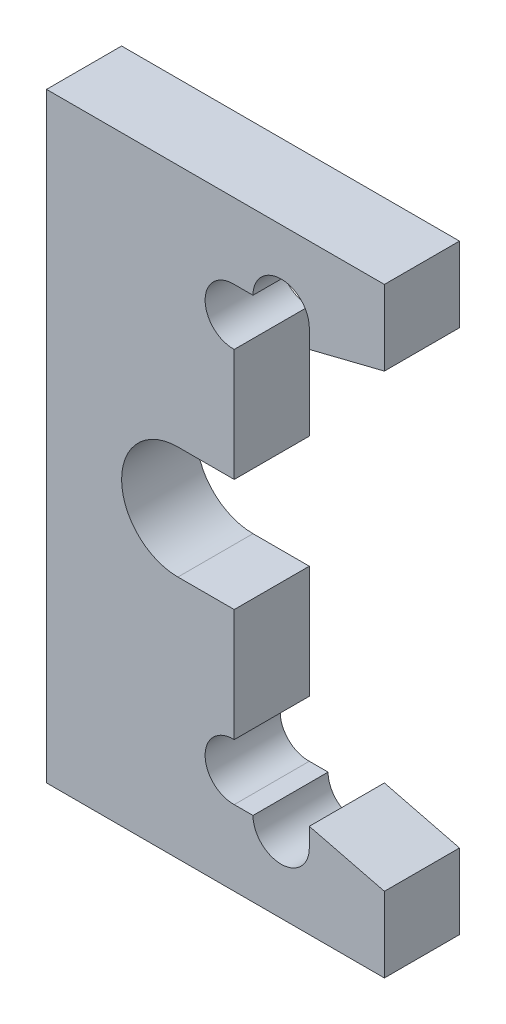
ISO-10303-21;
HEADER;
FILE_DESCRIPTION(('STEP AP214'),'2;1');
FILE_NAME('part.step','',(''),(''),'','','');
FILE_SCHEMA(('AUTOMOTIVE_DESIGN { 1 0 10303 214 1 1 1 1 }'));
ENDSEC;
DATA;
#1=APPLICATION_CONTEXT('core data for automotive mechanical design processes');
#2=APPLICATION_PROTOCOL_DEFINITION('international standard','automotive_design',2000,#1);
#3=PRODUCT_CONTEXT('',#1,'mechanical');
#4=PRODUCT('Part','Part','',(#3));
#5=PRODUCT_RELATED_PRODUCT_CATEGORY('part','',(#4));
#6=PRODUCT_DEFINITION_FORMATION('','',#4);
#7=PRODUCT_DEFINITION_CONTEXT('part definition',#1,'design');
#8=PRODUCT_DEFINITION('design','',#6,#7);
#9=PRODUCT_DEFINITION_SHAPE('','',#8);
#10=(LENGTH_UNIT() NAMED_UNIT(*) SI_UNIT(.MILLI.,.METRE.));
#11=(NAMED_UNIT(*) PLANE_ANGLE_UNIT() SI_UNIT($,.RADIAN.));
#12=(NAMED_UNIT(*) SI_UNIT($,.STERADIAN.) SOLID_ANGLE_UNIT());
#13=UNCERTAINTY_MEASURE_WITH_UNIT(LENGTH_MEASURE(1.E-05),#10,'distance_accuracy_value','');
#14=(GEOMETRIC_REPRESENTATION_CONTEXT(3) GLOBAL_UNCERTAINTY_ASSIGNED_CONTEXT((#13)) GLOBAL_UNIT_ASSIGNED_CONTEXT((#10,
#11,#12)) REPRESENTATION_CONTEXT('',''));
#15=CARTESIAN_POINT('',(0.,0.,0.));
#16=DIRECTION('',(0.,0.,1.));
#17=DIRECTION('',(1.,0.,0.));
#18=AXIS2_PLACEMENT_3D('',#15,#16,#17);
#19=CARTESIAN_POINT('',(9.34232295016829,10.6275109241625,2.));
#20=DIRECTION('',(0.,0.,-1.));
#21=DIRECTION('',(-1.,0.,0.));
#22=AXIS2_PLACEMENT_3D('',#19,#20,#21);
#23=CYLINDRICAL_SURFACE('',#22,0.75);
#24=CARTESIAN_POINT('',(9.34232295016829,10.6275109241625,0.));
#25=DIRECTION('',(0.,0.,-1.));
#26=DIRECTION('',(-1.,0.,0.));
#27=AXIS2_PLACEMENT_3D('',#24,#25,#26);
#28=CIRCLE('',#27,0.75);
#29=CARTESIAN_POINT('',(9.36817322137401,9.87795654756358,0.));
#30=VERTEX_POINT('',#29);
#31=CARTESIAN_POINT('',(9.36817322137401,11.3770653007614,0.));
#32=VERTEX_POINT('',#31);
#33=EDGE_CURVE('E150',#30,#32,#28,.T.);
#34=ORIENTED_EDGE('',*,*,#33,.T.);
#35=DIRECTION('',(0.,0.,-1.));
#36=VECTOR('',#35,1.);
#37=CARTESIAN_POINT('',(9.36817322137401,11.3770653007614,2.));
#38=LINE('',#37,#36);
#39=CARTESIAN_POINT('',(9.36817322137401,11.3770653007614,2.));
#40=VERTEX_POINT('',#39);
#41=EDGE_CURVE('E11',#40,#32,#38,.T.);
#42=ORIENTED_EDGE('',*,*,#41,.F.);
#43=CARTESIAN_POINT('',(9.34232295016829,10.6275109241625,2.));
#44=DIRECTION('',(0.,0.,-1.));
#45=DIRECTION('',(-1.,0.,0.));
#46=AXIS2_PLACEMENT_3D('',#43,#44,#45);
#47=CIRCLE('',#46,0.75);
#48=CARTESIAN_POINT('',(9.36817322137401,9.87795654756358,2.));
#49=VERTEX_POINT('',#48);
#50=EDGE_CURVE('E172',#49,#40,#47,.T.);
#51=ORIENTED_EDGE('',*,*,#50,.F.);
#52=DIRECTION('',(0.,0.,-1.));
#53=VECTOR('',#52,1.);
#54=CARTESIAN_POINT('',(9.36817322137401,9.87795654756358,2.));
#55=LINE('',#54,#53);
#56=EDGE_CURVE('E146',#49,#30,#55,.T.);
#57=ORIENTED_EDGE('',*,*,#56,.T.);
#58=EDGE_LOOP('',(#34,#42,#51,#57));
#59=FACE_BOUND('',#58,.T.);
#60=ADVANCED_FACE('F34',(#59),#23,.F.);
#61=CARTESIAN_POINT('',(9.86817322137401,11.3770653007614,2.));
#62=DIRECTION('',(0.,1.,0.));
#63=DIRECTION('',(-1.,0.,0.));
#64=AXIS2_PLACEMENT_3D('',#61,#62,#63);
#65=PLANE('',#64);
#66=DIRECTION('',(1.,0.,0.));
#67=VECTOR('',#66,1.);
#68=CARTESIAN_POINT('',(9.86817322137401,11.3770653007614,0.));
#69=LINE('',#68,#67);
#70=CARTESIAN_POINT('',(9.86817322137401,11.3770653007614,0.));
#71=VERTEX_POINT('',#70);
#72=EDGE_CURVE('E153',#32,#71,#69,.T.);
#73=ORIENTED_EDGE('',*,*,#72,.T.);
#74=DIRECTION('',(0.,0.,-1.));
#75=VECTOR('',#74,1.);
#76=CARTESIAN_POINT('',(9.86817322137401,11.3770653007614,2.));
#77=LINE('',#76,#75);
#78=CARTESIAN_POINT('',(9.86817322137401,11.3770653007614,2.));
#79=VERTEX_POINT('',#78);
#80=EDGE_CURVE('E42',#79,#71,#77,.T.);
#81=ORIENTED_EDGE('',*,*,#80,.F.);
#82=DIRECTION('',(1.,0.,0.));
#83=VECTOR('',#82,1.);
#84=CARTESIAN_POINT('',(9.86817322137401,11.3770653007614,2.));
#85=LINE('',#84,#83);
#86=EDGE_CURVE('E100',#40,#79,#85,.T.);
#87=ORIENTED_EDGE('',*,*,#86,.F.);
#88=ORIENTED_EDGE('',*,*,#41,.T.);
#89=EDGE_LOOP('',(#73,#81,#87,#88));
#90=FACE_BOUND('',#89,.T.);
#91=ADVANCED_FACE('F319',(#90),#65,.F.);
#92=CARTESIAN_POINT('',(10.618173221374,11.3770653007614,2.));
#93=DIRECTION('',(0.,0.,-1.));
#94=DIRECTION('',(-1.,0.,0.));
#95=AXIS2_PLACEMENT_3D('',#92,#93,#94);
#96=CYLINDRICAL_SURFACE('',#95,0.750000000000001);
#97=CARTESIAN_POINT('',(10.618173221374,11.3770653007614,0.));
#98=DIRECTION('',(0.,0.,-1.));
#99=DIRECTION('',(1.,0.,0.));
#100=AXIS2_PLACEMENT_3D('',#97,#98,#99);
#101=CIRCLE('',#100,0.750000000000001);
#102=CARTESIAN_POINT('',(11.368173221374,11.3770653007614,0.));
#103=VERTEX_POINT('',#102);
#104=EDGE_CURVE('E156',#71,#103,#101,.T.);
#105=ORIENTED_EDGE('',*,*,#104,.T.);
#106=DIRECTION('',(0.,0.,-1.));
#107=VECTOR('',#106,1.);
#108=CARTESIAN_POINT('',(11.368173221374,11.3770653007614,2.));
#109=LINE('',#108,#107);
#110=CARTESIAN_POINT('',(11.368173221374,11.3770653007614,2.));
#111=VERTEX_POINT('',#110);
#112=EDGE_CURVE('E186',#111,#103,#109,.T.);
#113=ORIENTED_EDGE('',*,*,#112,.F.);
#114=CARTESIAN_POINT('',(10.618173221374,11.3770653007614,2.));
#115=DIRECTION('',(0.,0.,-1.));
#116=DIRECTION('',(1.,0.,0.));
#117=AXIS2_PLACEMENT_3D('',#114,#115,#116);
#118=CIRCLE('',#117,0.750000000000001);
#119=EDGE_CURVE('E194',#79,#111,#118,.T.);
#120=ORIENTED_EDGE('',*,*,#119,.F.);
#121=ORIENTED_EDGE('',*,*,#80,.T.);
#122=EDGE_LOOP('',(#105,#113,#120,#121));
#123=FACE_BOUND('',#122,.T.);
#124=ADVANCED_FACE('F192',(#123),#96,.F.);
#125=CARTESIAN_POINT('',(11.368173221374,11.3770653007614,2.));
#126=DIRECTION('',(1.,0.,0.));
#127=DIRECTION('',(0.,0.,-1.));
#128=AXIS2_PLACEMENT_3D('',#125,#126,#127);
#129=PLANE('',#128);
#130=DIRECTION('',(0.,-1.,0.));
#131=VECTOR('',#130,1.);
#132=CARTESIAN_POINT('',(11.368173221374,11.3770653007614,0.));
#133=LINE('',#132,#131);
#134=CARTESIAN_POINT('',(11.368173221374,10.8770653007614,0.));
#135=VERTEX_POINT('',#134);
#136=EDGE_CURVE('E158',#103,#135,#133,.T.);
#137=ORIENTED_EDGE('',*,*,#136,.T.);
#138=DIRECTION('',(0.,0.,-1.));
#139=VECTOR('',#138,1.);
#140=CARTESIAN_POINT('',(11.368173221374,10.8770653007614,2.));
#141=LINE('',#140,#139);
#142=CARTESIAN_POINT('',(11.368173221374,10.8770653007614,2.));
#143=VERTEX_POINT('',#142);
#144=EDGE_CURVE('E183',#143,#135,#141,.T.);
#145=ORIENTED_EDGE('',*,*,#144,.F.);
#146=DIRECTION('',(0.,-1.,0.));
#147=VECTOR('',#146,1.);
#148=CARTESIAN_POINT('',(11.368173221374,11.3770653007614,2.));
#149=LINE('',#148,#147);
#150=EDGE_CURVE('E212',#111,#143,#149,.T.);
#151=ORIENTED_EDGE('',*,*,#150,.F.);
#152=ORIENTED_EDGE('',*,*,#112,.T.);
#153=EDGE_LOOP('',(#137,#145,#151,#152));
#154=FACE_BOUND('',#153,.T.);
#155=ADVANCED_FACE('F203',(#154),#129,.F.);
#156=CARTESIAN_POINT('',(11.368173221374,10.8770653007614,2.));
#157=DIRECTION('',(-0.242535625036333,0.970142500145332,0.));
#158=DIRECTION('',(-0.970142500145332,-0.242535625036333,0.));
#159=AXIS2_PLACEMENT_3D('',#156,#157,#158);
#160=PLANE('',#159);
#161=DIRECTION('',(0.970142500145332,0.242535625036333,0.));
#162=VECTOR('',#161,1.);
#163=CARTESIAN_POINT('',(11.368173221374,10.8770653007614,0.));
#164=LINE('',#163,#162);
#165=CARTESIAN_POINT('',(13.368173221374,11.3770653007614,0.));
#166=VERTEX_POINT('',#165);
#167=EDGE_CURVE('E160',#135,#166,#164,.T.);
#168=ORIENTED_EDGE('',*,*,#167,.T.);
#169=DIRECTION('',(0.,0.,-1.));
#170=VECTOR('',#169,1.);
#171=CARTESIAN_POINT('',(13.368173221374,11.3770653007614,2.));
#172=LINE('',#171,#170);
#173=CARTESIAN_POINT('',(13.368173221374,11.3770653007614,2.));
#174=VERTEX_POINT('',#173);
#175=EDGE_CURVE('E180',#174,#166,#172,.T.);
#176=ORIENTED_EDGE('',*,*,#175,.F.);
#177=DIRECTION('',(0.970142500145332,0.242535625036333,0.));
#178=VECTOR('',#177,1.);
#179=CARTESIAN_POINT('',(11.368173221374,10.8770653007614,2.));
#180=LINE('',#179,#178);
#181=EDGE_CURVE('E209',#143,#174,#180,.T.);
#182=ORIENTED_EDGE('',*,*,#181,.F.);
#183=ORIENTED_EDGE('',*,*,#144,.T.);
#184=EDGE_LOOP('',(#168,#176,#182,#183));
#185=FACE_BOUND('',#184,.T.);
#186=ADVANCED_FACE('F207',(#185),#160,.F.);
#187=CARTESIAN_POINT('',(13.368173221374,11.3770653007614,2.));
#188=DIRECTION('',(-1.,0.,0.));
#189=DIRECTION('',(0.,0.,1.));
#190=AXIS2_PLACEMENT_3D('',#187,#188,#189);
#191=PLANE('',#190);
#192=DIRECTION('',(0.,1.,0.));
#193=VECTOR('',#192,1.);
#194=CARTESIAN_POINT('',(13.368173221374,11.3770653007614,0.));
#195=LINE('',#194,#193);
#196=CARTESIAN_POINT('',(13.368173221374,13.3770653007614,0.));
#197=VERTEX_POINT('',#196);
#198=EDGE_CURVE('E162',#166,#197,#195,.T.);
#199=ORIENTED_EDGE('',*,*,#198,.T.);
#200=DIRECTION('',(0.,0.,-1.));
#201=VECTOR('',#200,1.);
#202=CARTESIAN_POINT('',(13.368173221374,13.3770653007614,2.));
#203=LINE('',#202,#201);
#204=CARTESIAN_POINT('',(13.368173221374,13.3770653007614,2.));
#205=VERTEX_POINT('',#204);
#206=EDGE_CURVE('E177',#205,#197,#203,.T.);
#207=ORIENTED_EDGE('',*,*,#206,.F.);
#208=DIRECTION('',(0.,1.,0.));
#209=VECTOR('',#208,1.);
#210=CARTESIAN_POINT('',(13.368173221374,11.3770653007614,2.));
#211=LINE('',#210,#209);
#212=EDGE_CURVE('E211',#174,#205,#211,.T.);
#213=ORIENTED_EDGE('',*,*,#212,.F.);
#214=ORIENTED_EDGE('',*,*,#175,.T.);
#215=EDGE_LOOP('',(#199,#207,#213,#214));
#216=FACE_BOUND('',#215,.T.);
#217=ADVANCED_FACE('F331',(#216),#191,.F.);
#218=CARTESIAN_POINT('',(13.368173221374,13.3770653007614,2.));
#219=DIRECTION('',(0.,-1.,0.));
#220=DIRECTION('',(1.,0.,0.));
#221=AXIS2_PLACEMENT_3D('',#218,#219,#220);
#222=PLANE('',#221);
#223=DIRECTION('',(-1.,0.,0.));
#224=VECTOR('',#223,1.);
#225=CARTESIAN_POINT('',(13.368173221374,13.3770653007614,0.));
#226=LINE('',#225,#224);
#227=CARTESIAN_POINT('',(4.36817322137401,13.3770653007614,0.));
#228=VERTEX_POINT('',#227);
#229=EDGE_CURVE('E164',#197,#228,#226,.T.);
#230=ORIENTED_EDGE('',*,*,#229,.T.);
#231=DIRECTION('',(0.,0.,-1.));
#232=VECTOR('',#231,1.);
#233=CARTESIAN_POINT('',(4.36817322137401,13.3770653007614,2.));
#234=LINE('',#233,#232);
#235=CARTESIAN_POINT('',(4.36817322137401,13.3770653007614,2.));
#236=VERTEX_POINT('',#235);
#237=EDGE_CURVE('E141',#236,#228,#234,.T.);
#238=ORIENTED_EDGE('',*,*,#237,.F.);
#239=DIRECTION('',(-1.,0.,0.));
#240=VECTOR('',#239,1.);
#241=CARTESIAN_POINT('',(13.368173221374,13.3770653007614,2.));
#242=LINE('',#241,#240);
#243=EDGE_CURVE('E214',#205,#236,#242,.T.);
#244=ORIENTED_EDGE('',*,*,#243,.F.);
#245=ORIENTED_EDGE('',*,*,#206,.T.);
#246=EDGE_LOOP('',(#230,#238,#244,#245));
#247=FACE_BOUND('',#246,.T.);
#248=ADVANCED_FACE('F334',(#247),#222,.F.);
#249=CARTESIAN_POINT('',(4.36817322137401,13.3770653007614,2.));
#250=DIRECTION('',(1.,0.,0.));
#251=DIRECTION('',(0.,1.,0.));
#252=AXIS2_PLACEMENT_3D('',#249,#250,#251);
#253=PLANE('',#252);
#254=DIRECTION('',(0.,-1.,0.));
#255=VECTOR('',#254,1.);
#256=CARTESIAN_POINT('',(4.36817322137401,13.3770653007614,0.));
#257=LINE('',#256,#255);
#258=CARTESIAN_POINT('',(4.368173221374,-2.62293469923858,0.));
#259=VERTEX_POINT('',#258);
#260=EDGE_CURVE('E166',#228,#259,#257,.T.);
#261=ORIENTED_EDGE('',*,*,#260,.T.);
#262=DIRECTION('',(0.,0.,-1.));
#263=VECTOR('',#262,1.);
#264=CARTESIAN_POINT('',(4.368173221374,-2.62293469923858,2.));
#265=LINE('',#264,#263);
#266=CARTESIAN_POINT('',(4.368173221374,-2.62293469923858,2.));
#267=VERTEX_POINT('',#266);
#268=EDGE_CURVE('E234',#267,#259,#265,.T.);
#269=ORIENTED_EDGE('',*,*,#268,.F.);
#270=DIRECTION('',(0.,-1.,0.));
#271=VECTOR('',#270,1.);
#272=CARTESIAN_POINT('',(4.36817322137401,13.3770653007614,2.));
#273=LINE('',#272,#271);
#274=EDGE_CURVE('E135',#236,#267,#273,.T.);
#275=ORIENTED_EDGE('',*,*,#274,.F.);
#276=ORIENTED_EDGE('',*,*,#237,.T.);
#277=EDGE_LOOP('',(#261,#269,#275,#276));
#278=FACE_BOUND('',#277,.T.);
#279=ADVANCED_FACE('F235',(#278),#253,.F.);
#280=CARTESIAN_POINT('',(7.86817322137401,5.37706530076142,2.));
#281=DIRECTION('',(0.,0.,-1.));
#282=DIRECTION('',(-1.,0.,0.));
#283=AXIS2_PLACEMENT_3D('',#280,#281,#282);
#284=CYLINDRICAL_SURFACE('',#283,1.5);
#285=CARTESIAN_POINT('',(7.86817322137401,5.37706530076142,0.));
#286=DIRECTION('',(0.,0.,-1.));
#287=DIRECTION('',(1.,0.,0.));
#288=AXIS2_PLACEMENT_3D('',#285,#286,#287);
#289=CIRCLE('',#288,1.5);
#290=CARTESIAN_POINT('',(7.86817322137401,3.87706530076142,0.));
#291=VERTEX_POINT('',#290);
#292=CARTESIAN_POINT('',(7.86817322137401,6.87706530076142,0.));
#293=VERTEX_POINT('',#292);
#294=EDGE_CURVE('E140',#291,#293,#289,.T.);
#295=ORIENTED_EDGE('',*,*,#294,.T.);
#296=DIRECTION('',(0.,0.,-1.));
#297=VECTOR('',#296,1.);
#298=CARTESIAN_POINT('',(7.86817322137401,6.87706530076142,2.));
#299=LINE('',#298,#297);
#300=CARTESIAN_POINT('',(7.86817322137401,6.87706530076142,2.));
#301=VERTEX_POINT('',#300);
#302=EDGE_CURVE('E137',#301,#293,#299,.T.);
#303=ORIENTED_EDGE('',*,*,#302,.F.);
#304=CARTESIAN_POINT('',(7.86817322137401,5.37706530076142,2.));
#305=DIRECTION('',(0.,0.,-1.));
#306=DIRECTION('',(1.,0.,0.));
#307=AXIS2_PLACEMENT_3D('',#304,#305,#306);
#308=CIRCLE('',#307,1.5);
#309=CARTESIAN_POINT('',(7.86817322137401,3.87706530076142,2.));
#310=VERTEX_POINT('',#309);
#311=EDGE_CURVE('E123',#310,#301,#308,.T.);
#312=ORIENTED_EDGE('',*,*,#311,.F.);
#313=DIRECTION('',(0.,0.,-1.));
#314=VECTOR('',#313,1.);
#315=CARTESIAN_POINT('',(7.86817322137401,3.87706530076142,2.));
#316=LINE('',#315,#314);
#317=EDGE_CURVE('E241',#310,#291,#316,.T.);
#318=ORIENTED_EDGE('',*,*,#317,.T.);
#319=EDGE_LOOP('',(#295,#303,#312,#318));
#320=FACE_BOUND('',#319,.T.);
#321=ADVANCED_FACE('F138',(#320),#284,.F.);
#322=CARTESIAN_POINT('',(9.36817322137401,6.87706530076142,2.));
#323=DIRECTION('',(0.,1.,0.));
#324=DIRECTION('',(0.,0.,1.));
#325=AXIS2_PLACEMENT_3D('',#322,#323,#324);
#326=PLANE('',#325);
#327=DIRECTION('',(1.,0.,0.));
#328=VECTOR('',#327,1.);
#329=CARTESIAN_POINT('',(9.36817322137401,6.87706530076142,0.));
#330=LINE('',#329,#328);
#331=CARTESIAN_POINT('',(9.36817322137401,6.87706530076142,0.));
#332=VERTEX_POINT('',#331);
#333=EDGE_CURVE('E86',#293,#332,#330,.T.);
#334=ORIENTED_EDGE('',*,*,#333,.T.);
#335=DIRECTION('',(0.,0.,-1.));
#336=VECTOR('',#335,1.);
#337=CARTESIAN_POINT('',(9.36817322137401,6.87706530076142,2.));
#338=LINE('',#337,#336);
#339=CARTESIAN_POINT('',(9.36817322137401,6.87706530076142,2.));
#340=VERTEX_POINT('',#339);
#341=EDGE_CURVE('E142',#340,#332,#338,.T.);
#342=ORIENTED_EDGE('',*,*,#341,.F.);
#343=DIRECTION('',(1.,0.,0.));
#344=VECTOR('',#343,1.);
#345=CARTESIAN_POINT('',(9.36817322137401,6.87706530076142,2.));
#346=LINE('',#345,#344);
#347=EDGE_CURVE('E127',#301,#340,#346,.T.);
#348=ORIENTED_EDGE('',*,*,#347,.F.);
#349=ORIENTED_EDGE('',*,*,#302,.T.);
#350=EDGE_LOOP('',(#334,#342,#348,#349));
#351=FACE_BOUND('',#350,.T.);
#352=ADVANCED_FACE('F144',(#351),#326,.F.);
#353=CARTESIAN_POINT('',(9.36817322137401,9.87795654756358,2.));
#354=DIRECTION('',(-1.,0.,0.));
#355=DIRECTION('',(0.,0.,1.));
#356=AXIS2_PLACEMENT_3D('',#353,#354,#355);
#357=PLANE('',#356);
#358=DIRECTION('',(0.,1.,0.));
#359=VECTOR('',#358,1.);
#360=CARTESIAN_POINT('',(9.36817322137401,9.87795654756358,0.));
#361=LINE('',#360,#359);
#362=EDGE_CURVE('E92',#332,#30,#361,.T.);
#363=ORIENTED_EDGE('',*,*,#362,.T.);
#364=ORIENTED_EDGE('',*,*,#56,.F.);
#365=DIRECTION('',(0.,1.,0.));
#366=VECTOR('',#365,1.);
#367=CARTESIAN_POINT('',(9.36817322137401,9.87795654756358,2.));
#368=LINE('',#367,#366);
#369=EDGE_CURVE('E50',#340,#49,#368,.T.);
#370=ORIENTED_EDGE('',*,*,#369,.F.);
#371=ORIENTED_EDGE('',*,*,#341,.T.);
#372=EDGE_LOOP('',(#363,#364,#370,#371));
#373=FACE_BOUND('',#372,.T.);
#374=ADVANCED_FACE('F345',(#373),#357,.F.);
#375=CARTESIAN_POINT('',(9.34232295016829,10.6275109241625,2.));
#376=DIRECTION('',(0.,0.,-1.));
#377=DIRECTION('',(-1.,0.,0.));
#378=AXIS2_PLACEMENT_3D('',#375,#376,#377);
#379=PLANE('',#378);
#380=ORIENTED_EDGE('',*,*,#50,.T.);
#381=ORIENTED_EDGE('',*,*,#86,.T.);
#382=ORIENTED_EDGE('',*,*,#119,.T.);
#383=ORIENTED_EDGE('',*,*,#150,.T.);
#384=ORIENTED_EDGE('',*,*,#181,.T.);
#385=ORIENTED_EDGE('',*,*,#212,.T.);
#386=ORIENTED_EDGE('',*,*,#243,.T.);
#387=ORIENTED_EDGE('',*,*,#274,.T.);
#388=DIRECTION('',(-1.,0.,0.));
#389=VECTOR('',#388,1.);
#390=CARTESIAN_POINT('',(13.368173221374,-2.62293469923859,2.));
#391=LINE('',#390,#389);
#392=CARTESIAN_POINT('',(13.368173221374,-2.62293469923859,2.));
#393=VERTEX_POINT('',#392);
#394=EDGE_CURVE('E227',#393,#267,#391,.T.);
#395=ORIENTED_EDGE('',*,*,#394,.F.);
#396=DIRECTION('',(0.,-1.,0.));
#397=VECTOR('',#396,1.);
#398=CARTESIAN_POINT('',(13.368173221374,-0.622934699238586,2.));
#399=LINE('',#398,#397);
#400=CARTESIAN_POINT('',(13.368173221374,-0.622934699238586,2.));
#401=VERTEX_POINT('',#400);
#402=EDGE_CURVE('E247',#401,#393,#399,.T.);
#403=ORIENTED_EDGE('',*,*,#402,.F.);
#404=DIRECTION('',(0.970142500145332,-0.242535625036334,0.));
#405=VECTOR('',#404,1.);
#406=CARTESIAN_POINT('',(11.368173221374,-0.122934699238584,2.));
#407=LINE('',#406,#405);
#408=CARTESIAN_POINT('',(11.368173221374,-0.122934699238584,2.));
#409=VERTEX_POINT('',#408);
#410=EDGE_CURVE('E249',#409,#401,#407,.T.);
#411=ORIENTED_EDGE('',*,*,#410,.F.);
#412=DIRECTION('',(0.,1.,0.));
#413=VECTOR('',#412,1.);
#414=CARTESIAN_POINT('',(11.368173221374,-0.622934699238584,2.));
#415=LINE('',#414,#413);
#416=CARTESIAN_POINT('',(11.368173221374,-0.622934699238584,2.));
#417=VERTEX_POINT('',#416);
#418=EDGE_CURVE('E257',#417,#409,#415,.T.);
#419=ORIENTED_EDGE('',*,*,#418,.F.);
#420=CARTESIAN_POINT('',(10.618173221374,-0.622934699238582,2.));
#421=DIRECTION('',(0.,0.,1.));
#422=DIRECTION('',(1.,0.,0.));
#423=AXIS2_PLACEMENT_3D('',#420,#421,#422);
#424=CIRCLE('',#423,0.750000000000001);
#425=CARTESIAN_POINT('',(9.86817322137401,-0.622934699238581,2.));
#426=VERTEX_POINT('',#425);
#427=EDGE_CURVE('E260',#426,#417,#424,.T.);
#428=ORIENTED_EDGE('',*,*,#427,.F.);
#429=DIRECTION('',(1.,0.,0.));
#430=VECTOR('',#429,1.);
#431=CARTESIAN_POINT('',(9.86817322137401,-0.622934699238581,2.));
#432=LINE('',#431,#430);
#433=CARTESIAN_POINT('',(9.36817322137401,-0.622934699238582,2.));
#434=VERTEX_POINT('',#433);
#435=EDGE_CURVE('E263',#434,#426,#432,.T.);
#436=ORIENTED_EDGE('',*,*,#435,.F.);
#437=CARTESIAN_POINT('',(9.34232295016828,0.126619677360334,2.));
#438=DIRECTION('',(0.,0.,1.));
#439=DIRECTION('',(-1.,0.,0.));
#440=AXIS2_PLACEMENT_3D('',#437,#438,#439);
#441=CIRCLE('',#440,0.75);
#442=CARTESIAN_POINT('',(9.36817322137401,0.876174053959251,2.));
#443=VERTEX_POINT('',#442);
#444=EDGE_CURVE('E293',#443,#434,#441,.T.);
#445=ORIENTED_EDGE('',*,*,#444,.F.);
#446=DIRECTION('',(0.,-1.,0.));
#447=VECTOR('',#446,1.);
#448=CARTESIAN_POINT('',(9.36817322137401,0.876174053959251,2.));
#449=LINE('',#448,#447);
#450=CARTESIAN_POINT('',(9.36817322137401,3.87706530076142,2.));
#451=VERTEX_POINT('',#450);
#452=EDGE_CURVE('E251',#451,#443,#449,.T.);
#453=ORIENTED_EDGE('',*,*,#452,.F.);
#454=DIRECTION('',(1.,0.,0.));
#455=VECTOR('',#454,1.);
#456=CARTESIAN_POINT('',(9.36817322137401,3.87706530076142,2.));
#457=LINE('',#456,#455);
#458=EDGE_CURVE('E131',#310,#451,#457,.T.);
#459=ORIENTED_EDGE('',*,*,#458,.F.);
#460=ORIENTED_EDGE('',*,*,#311,.T.);
#461=ORIENTED_EDGE('',*,*,#347,.T.);
#462=ORIENTED_EDGE('',*,*,#369,.T.);
#463=EDGE_LOOP('',(#380,#381,#382,#383,#384,#385,#386,#387,#395,#403,#411,#419,#428,#436,#445,
#453,#459,#460,#461,#462));
#464=FACE_BOUND('',#463,.T.);
#465=ADVANCED_FACE('F125',(#464),#379,.F.);
#466=CARTESIAN_POINT('',(9.34232295016829,10.6275109241625,0.));
#467=DIRECTION('',(0.,0.,-1.));
#468=DIRECTION('',(-1.,0.,0.));
#469=AXIS2_PLACEMENT_3D('',#466,#467,#468);
#470=PLANE('',#469);
#471=ORIENTED_EDGE('',*,*,#33,.F.);
#472=ORIENTED_EDGE('',*,*,#362,.F.);
#473=ORIENTED_EDGE('',*,*,#333,.F.);
#474=ORIENTED_EDGE('',*,*,#294,.F.);
#475=DIRECTION('',(1.,0.,0.));
#476=VECTOR('',#475,1.);
#477=CARTESIAN_POINT('',(9.36817322137401,3.87706530076142,0.));
#478=LINE('',#477,#476);
#479=CARTESIAN_POINT('',(9.36817322137401,3.87706530076142,0.));
#480=VERTEX_POINT('',#479);
#481=EDGE_CURVE('E273',#291,#480,#478,.T.);
#482=ORIENTED_EDGE('',*,*,#481,.T.);
#483=DIRECTION('',(0.,-1.,0.));
#484=VECTOR('',#483,1.);
#485=CARTESIAN_POINT('',(9.36817322137401,0.876174053959251,0.));
#486=LINE('',#485,#484);
#487=CARTESIAN_POINT('',(9.36817322137401,0.876174053959251,0.));
#488=VERTEX_POINT('',#487);
#489=EDGE_CURVE('E270',#480,#488,#486,.T.);
#490=ORIENTED_EDGE('',*,*,#489,.T.);
#491=CARTESIAN_POINT('',(9.34232295016828,0.126619677360334,0.));
#492=DIRECTION('',(0.,0.,1.));
#493=DIRECTION('',(-1.,0.,0.));
#494=AXIS2_PLACEMENT_3D('',#491,#492,#493);
#495=CIRCLE('',#494,0.75);
#496=CARTESIAN_POINT('',(9.36817322137401,-0.622934699238582,0.));
#497=VERTEX_POINT('',#496);
#498=EDGE_CURVE('E267',#488,#497,#495,.T.);
#499=ORIENTED_EDGE('',*,*,#498,.T.);
#500=DIRECTION('',(1.,0.,0.));
#501=VECTOR('',#500,1.);
#502=CARTESIAN_POINT('',(9.86817322137401,-0.622934699238581,0.));
#503=LINE('',#502,#501);
#504=CARTESIAN_POINT('',(9.86817322137401,-0.622934699238581,0.));
#505=VERTEX_POINT('',#504);
#506=EDGE_CURVE('E290',#497,#505,#503,.T.);
#507=ORIENTED_EDGE('',*,*,#506,.T.);
#508=CARTESIAN_POINT('',(10.618173221374,-0.622934699238582,0.));
#509=DIRECTION('',(0.,0.,1.));
#510=DIRECTION('',(1.,0.,0.));
#511=AXIS2_PLACEMENT_3D('',#508,#509,#510);
#512=CIRCLE('',#511,0.750000000000001);
#513=CARTESIAN_POINT('',(11.368173221374,-0.622934699238584,0.));
#514=VERTEX_POINT('',#513);
#515=EDGE_CURVE('E287',#505,#514,#512,.T.);
#516=ORIENTED_EDGE('',*,*,#515,.T.);
#517=DIRECTION('',(0.,1.,0.));
#518=VECTOR('',#517,1.);
#519=CARTESIAN_POINT('',(11.368173221374,-0.622934699238584,0.));
#520=LINE('',#519,#518);
#521=CARTESIAN_POINT('',(11.368173221374,-0.122934699238584,0.));
#522=VERTEX_POINT('',#521);
#523=EDGE_CURVE('E284',#514,#522,#520,.T.);
#524=ORIENTED_EDGE('',*,*,#523,.T.);
#525=DIRECTION('',(0.970142500145332,-0.242535625036334,0.));
#526=VECTOR('',#525,1.);
#527=CARTESIAN_POINT('',(11.368173221374,-0.122934699238584,0.));
#528=LINE('',#527,#526);
#529=CARTESIAN_POINT('',(13.368173221374,-0.622934699238586,0.));
#530=VERTEX_POINT('',#529);
#531=EDGE_CURVE('E281',#522,#530,#528,.T.);
#532=ORIENTED_EDGE('',*,*,#531,.T.);
#533=DIRECTION('',(0.,-1.,0.));
#534=VECTOR('',#533,1.);
#535=CARTESIAN_POINT('',(13.368173221374,-0.622934699238586,0.));
#536=LINE('',#535,#534);
#537=CARTESIAN_POINT('',(13.368173221374,-2.62293469923859,0.));
#538=VERTEX_POINT('',#537);
#539=EDGE_CURVE('E278',#530,#538,#536,.T.);
#540=ORIENTED_EDGE('',*,*,#539,.T.);
#541=DIRECTION('',(-1.,0.,0.));
#542=VECTOR('',#541,1.);
#543=CARTESIAN_POINT('',(13.368173221374,-2.62293469923859,0.));
#544=LINE('',#543,#542);
#545=EDGE_CURVE('E276',#538,#259,#544,.T.);
#546=ORIENTED_EDGE('',*,*,#545,.T.);
#547=ORIENTED_EDGE('',*,*,#260,.F.);
#548=ORIENTED_EDGE('',*,*,#229,.F.);
#549=ORIENTED_EDGE('',*,*,#198,.F.);
#550=ORIENTED_EDGE('',*,*,#167,.F.);
#551=ORIENTED_EDGE('',*,*,#136,.F.);
#552=ORIENTED_EDGE('',*,*,#104,.F.);
#553=ORIENTED_EDGE('',*,*,#72,.F.);
#554=EDGE_LOOP('',(#471,#472,#473,#474,#482,#490,#499,#507,#516,#524,#532,#540,#546,#547,#548,
#549,#550,#551,#552,#553));
#555=FACE_BOUND('',#554,.T.);
#556=ADVANCED_FACE('F198',(#555),#470,.T.);
#557=CARTESIAN_POINT('',(9.34232295016828,0.126619677360334,2.));
#558=DIRECTION('',(0.,0.,-1.));
#559=DIRECTION('',(-1.,0.,0.));
#560=AXIS2_PLACEMENT_3D('',#557,#558,#559);
#561=CYLINDRICAL_SURFACE('',#560,0.75);
#562=ORIENTED_EDGE('',*,*,#498,.F.);
#563=DIRECTION('',(0.,0.,-1.));
#564=VECTOR('',#563,1.);
#565=CARTESIAN_POINT('',(9.36817322137401,0.876174053959251,2.));
#566=LINE('',#565,#564);
#567=EDGE_CURVE('E154',#443,#488,#566,.T.);
#568=ORIENTED_EDGE('',*,*,#567,.F.);
#569=ORIENTED_EDGE('',*,*,#444,.T.);
#570=DIRECTION('',(0.,0.,-1.));
#571=VECTOR('',#570,1.);
#572=CARTESIAN_POINT('',(9.36817322137401,-0.622934699238582,2.));
#573=LINE('',#572,#571);
#574=EDGE_CURVE('E266',#434,#497,#573,.T.);
#575=ORIENTED_EDGE('',*,*,#574,.T.);
#576=EDGE_LOOP('',(#562,#568,#569,#575));
#577=FACE_BOUND('',#576,.T.);
#578=ADVANCED_FACE('F350',(#577),#561,.F.);
#579=CARTESIAN_POINT('',(9.36817322137401,0.876174053959251,2.));
#580=DIRECTION('',(1.,0.,0.));
#581=DIRECTION('',(0.,1.,0.));
#582=AXIS2_PLACEMENT_3D('',#579,#580,#581);
#583=PLANE('',#582);
#584=ORIENTED_EDGE('',*,*,#489,.F.);
#585=DIRECTION('',(0.,0.,-1.));
#586=VECTOR('',#585,1.);
#587=CARTESIAN_POINT('',(9.36817322137401,3.87706530076142,2.));
#588=LINE('',#587,#586);
#589=EDGE_CURVE('E310',#451,#480,#588,.T.);
#590=ORIENTED_EDGE('',*,*,#589,.F.);
#591=ORIENTED_EDGE('',*,*,#452,.T.);
#592=ORIENTED_EDGE('',*,*,#567,.T.);
#593=EDGE_LOOP('',(#584,#590,#591,#592));
#594=FACE_BOUND('',#593,.T.);
#595=ADVANCED_FACE('F355',(#594),#583,.T.);
#596=CARTESIAN_POINT('',(9.36817322137401,3.87706530076142,2.));
#597=DIRECTION('',(0.,1.,0.));
#598=DIRECTION('',(-1.,0.,0.));
#599=AXIS2_PLACEMENT_3D('',#596,#597,#598);
#600=PLANE('',#599);
#601=ORIENTED_EDGE('',*,*,#481,.F.);
#602=ORIENTED_EDGE('',*,*,#317,.F.);
#603=ORIENTED_EDGE('',*,*,#458,.T.);
#604=ORIENTED_EDGE('',*,*,#589,.T.);
#605=EDGE_LOOP('',(#601,#602,#603,#604));
#606=FACE_BOUND('',#605,.T.);
#607=ADVANCED_FACE('F359',(#606),#600,.T.);
#608=CARTESIAN_POINT('',(13.368173221374,-2.62293469923859,2.));
#609=DIRECTION('',(0.,-1.,0.));
#610=DIRECTION('',(1.,0.,0.));
#611=AXIS2_PLACEMENT_3D('',#608,#609,#610);
#612=PLANE('',#611);
#613=ORIENTED_EDGE('',*,*,#545,.F.);
#614=DIRECTION('',(0.,0.,-1.));
#615=VECTOR('',#614,1.);
#616=CARTESIAN_POINT('',(13.368173221374,-2.62293469923859,2.));
#617=LINE('',#616,#615);
#618=EDGE_CURVE('E242',#393,#538,#617,.T.);
#619=ORIENTED_EDGE('',*,*,#618,.F.);
#620=ORIENTED_EDGE('',*,*,#394,.T.);
#621=ORIENTED_EDGE('',*,*,#268,.T.);
#622=EDGE_LOOP('',(#613,#619,#620,#621));
#623=FACE_BOUND('',#622,.T.);
#624=ADVANCED_FACE('F245',(#623),#612,.T.);
#625=CARTESIAN_POINT('',(13.368173221374,-0.622934699238586,2.));
#626=DIRECTION('',(1.,0.,0.));
#627=DIRECTION('',(0.,1.,0.));
#628=AXIS2_PLACEMENT_3D('',#625,#626,#627);
#629=PLANE('',#628);
#630=ORIENTED_EDGE('',*,*,#539,.F.);
#631=DIRECTION('',(0.,0.,-1.));
#632=VECTOR('',#631,1.);
#633=CARTESIAN_POINT('',(13.368173221374,-0.622934699238586,2.));
#634=LINE('',#633,#632);
#635=EDGE_CURVE('E305',#401,#530,#634,.T.);
#636=ORIENTED_EDGE('',*,*,#635,.F.);
#637=ORIENTED_EDGE('',*,*,#402,.T.);
#638=ORIENTED_EDGE('',*,*,#618,.T.);
#639=EDGE_LOOP('',(#630,#636,#637,#638));
#640=FACE_BOUND('',#639,.T.);
#641=ADVANCED_FACE('F366',(#640),#629,.T.);
#642=CARTESIAN_POINT('',(11.368173221374,-0.122934699238584,2.));
#643=DIRECTION('',(0.242535625036334,0.970142500145332,0.));
#644=DIRECTION('',(-0.970142500145332,0.242535625036334,0.));
#645=AXIS2_PLACEMENT_3D('',#642,#643,#644);
#646=PLANE('',#645);
#647=ORIENTED_EDGE('',*,*,#531,.F.);
#648=DIRECTION('',(0.,0.,-1.));
#649=VECTOR('',#648,1.);
#650=CARTESIAN_POINT('',(11.368173221374,-0.122934699238584,2.));
#651=LINE('',#650,#649);
#652=EDGE_CURVE('E302',#409,#522,#651,.T.);
#653=ORIENTED_EDGE('',*,*,#652,.F.);
#654=ORIENTED_EDGE('',*,*,#410,.T.);
#655=ORIENTED_EDGE('',*,*,#635,.T.);
#656=EDGE_LOOP('',(#647,#653,#654,#655));
#657=FACE_BOUND('',#656,.T.);
#658=ADVANCED_FACE('F369',(#657),#646,.T.);
#659=CARTESIAN_POINT('',(11.368173221374,-0.622934699238584,2.));
#660=DIRECTION('',(-1.,0.,0.));
#661=DIRECTION('',(0.,-1.,0.));
#662=AXIS2_PLACEMENT_3D('',#659,#660,#661);
#663=PLANE('',#662);
#664=ORIENTED_EDGE('',*,*,#523,.F.);
#665=DIRECTION('',(0.,0.,-1.));
#666=VECTOR('',#665,1.);
#667=CARTESIAN_POINT('',(11.368173221374,-0.622934699238584,2.));
#668=LINE('',#667,#666);
#669=EDGE_CURVE('E299',#417,#514,#668,.T.);
#670=ORIENTED_EDGE('',*,*,#669,.F.);
#671=ORIENTED_EDGE('',*,*,#418,.T.);
#672=ORIENTED_EDGE('',*,*,#652,.T.);
#673=EDGE_LOOP('',(#664,#670,#671,#672));
#674=FACE_BOUND('',#673,.T.);
#675=ADVANCED_FACE('F373',(#674),#663,.T.);
#676=CARTESIAN_POINT('',(10.618173221374,-0.622934699238582,2.));
#677=DIRECTION('',(0.,0.,-1.));
#678=DIRECTION('',(-1.,0.,0.));
#679=AXIS2_PLACEMENT_3D('',#676,#677,#678);
#680=CYLINDRICAL_SURFACE('',#679,0.750000000000001);
#681=ORIENTED_EDGE('',*,*,#515,.F.);
#682=DIRECTION('',(0.,0.,-1.));
#683=VECTOR('',#682,1.);
#684=CARTESIAN_POINT('',(9.86817322137401,-0.622934699238581,2.));
#685=LINE('',#684,#683);
#686=EDGE_CURVE('E296',#426,#505,#685,.T.);
#687=ORIENTED_EDGE('',*,*,#686,.F.);
#688=ORIENTED_EDGE('',*,*,#427,.T.);
#689=ORIENTED_EDGE('',*,*,#669,.T.);
#690=EDGE_LOOP('',(#681,#687,#688,#689));
#691=FACE_BOUND('',#690,.T.);
#692=ADVANCED_FACE('F377',(#691),#680,.F.);
#693=CARTESIAN_POINT('',(9.86817322137401,-0.622934699238581,2.));
#694=DIRECTION('',(0.,1.,0.));
#695=DIRECTION('',(-1.,0.,0.));
#696=AXIS2_PLACEMENT_3D('',#693,#694,#695);
#697=PLANE('',#696);
#698=ORIENTED_EDGE('',*,*,#506,.F.);
#699=ORIENTED_EDGE('',*,*,#574,.F.);
#700=ORIENTED_EDGE('',*,*,#435,.T.);
#701=ORIENTED_EDGE('',*,*,#686,.T.);
#702=EDGE_LOOP('',(#698,#699,#700,#701));
#703=FACE_BOUND('',#702,.T.);
#704=ADVANCED_FACE('F381',(#703),#697,.T.);
#705=CLOSED_SHELL('',(#60,#91,#124,#155,#186,#217,#248,#279,#321,#352,#374,#465,#556,#578,#595,
#607,#624,#641,#658,#675,#692,#704));
#706=MANIFOLD_SOLID_BREP('B2',#705);
#707=ADVANCED_BREP_SHAPE_REPRESENTATION('',(#18,#706),#14);
#708=SHAPE_DEFINITION_REPRESENTATION(#9,#707);
ENDSEC;
END-ISO-10303-21;
